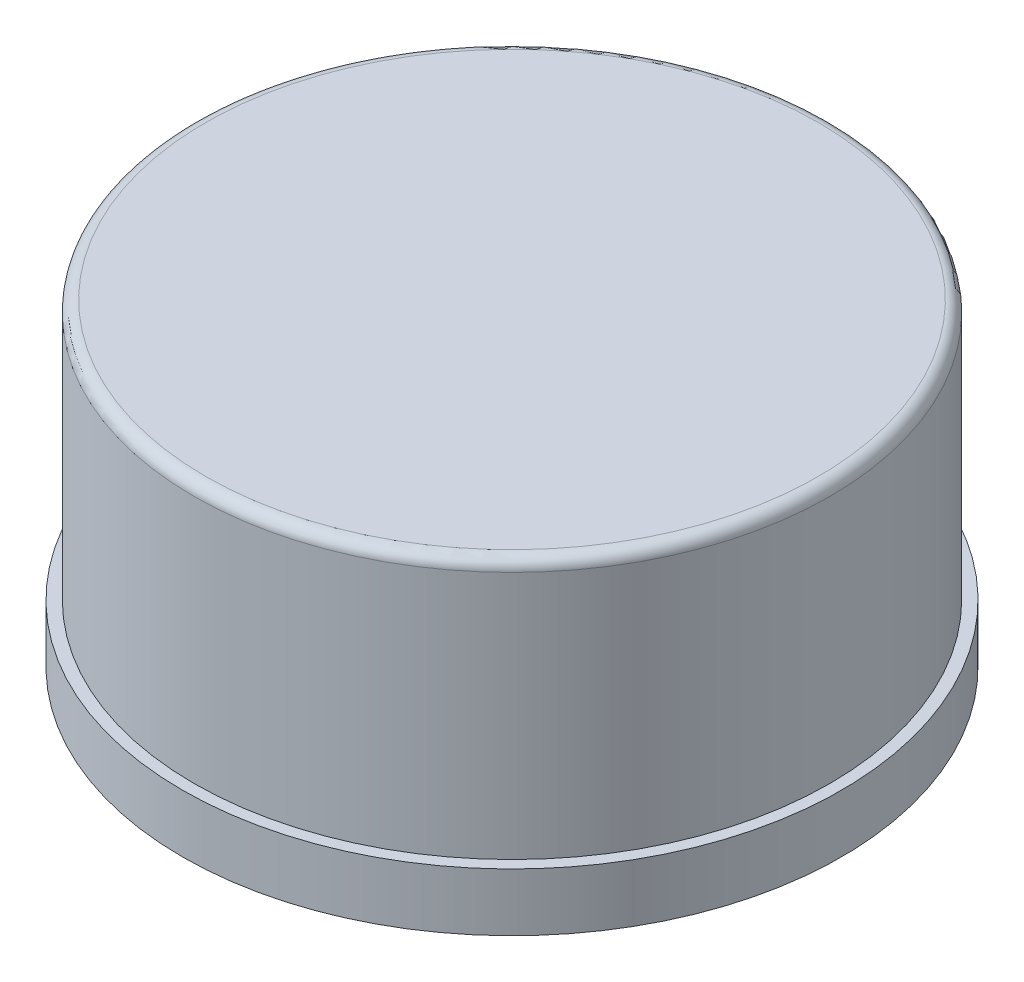
ISO-10303-21;
HEADER;
FILE_DESCRIPTION(('STEP AP214'),'2;1');
FILE_NAME('part.step','',(''),(''),'','','');
FILE_SCHEMA(('AUTOMOTIVE_DESIGN { 1 0 10303 214 1 1 1 1 }'));
ENDSEC;
DATA;
#1=APPLICATION_CONTEXT('core data for automotive mechanical design processes');
#2=APPLICATION_PROTOCOL_DEFINITION('international standard','automotive_design',2000,#1);
#3=PRODUCT_CONTEXT('',#1,'mechanical');
#4=PRODUCT('Part','Part','',(#3));
#5=PRODUCT_RELATED_PRODUCT_CATEGORY('part','',(#4));
#6=PRODUCT_DEFINITION_FORMATION('','',#4);
#7=PRODUCT_DEFINITION_CONTEXT('part definition',#1,'design');
#8=PRODUCT_DEFINITION('design','',#6,#7);
#9=PRODUCT_DEFINITION_SHAPE('','',#8);
#10=(LENGTH_UNIT() NAMED_UNIT(*) SI_UNIT(.MILLI.,.METRE.));
#11=(NAMED_UNIT(*) PLANE_ANGLE_UNIT() SI_UNIT($,.RADIAN.));
#12=(NAMED_UNIT(*) SI_UNIT($,.STERADIAN.) SOLID_ANGLE_UNIT());
#13=UNCERTAINTY_MEASURE_WITH_UNIT(LENGTH_MEASURE(1.E-05),#10,'distance_accuracy_value','');
#14=(GEOMETRIC_REPRESENTATION_CONTEXT(3) GLOBAL_UNCERTAINTY_ASSIGNED_CONTEXT((#13)) GLOBAL_UNIT_ASSIGNED_CONTEXT((#10,
#11,#12)) REPRESENTATION_CONTEXT('',''));
#15=CARTESIAN_POINT('',(0.,0.,0.));
#16=DIRECTION('',(0.,0.,1.));
#17=DIRECTION('',(1.,0.,0.));
#18=AXIS2_PLACEMENT_3D('',#15,#16,#17);
#19=CARTESIAN_POINT('',(0.,0.,0.));
#20=DIRECTION('',(0.,1.,0.));
#21=DIRECTION('',(0.,0.,1.));
#22=AXIS2_PLACEMENT_3D('',#19,#20,#21);
#23=PLANE('',#22);
#24=CARTESIAN_POINT('',(0.,0.,0.));
#25=DIRECTION('',(0.,1.,0.));
#26=DIRECTION('',(0.,0.,1.));
#27=AXIS2_PLACEMENT_3D('',#24,#25,#26);
#28=CIRCLE('',#27,5.7);
#29=CARTESIAN_POINT('',(0.,0.,5.7));
#30=VERTEX_POINT('',#29);
#31=EDGE_CURVE('E175',#30,#30,#28,.T.);
#32=ORIENTED_EDGE('',*,*,#31,.F.);
#33=EDGE_LOOP('',(#32));
#34=FACE_BOUND('',#33,.T.);
#35=DIRECTION('',(0.,0.,1.));
#36=VECTOR('',#35,1.);
#37=CARTESIAN_POINT('',(2.5,0.,-2.5));
#38=LINE('',#37,#36);
#39=CARTESIAN_POINT('',(2.5,0.,-2.5));
#40=VERTEX_POINT('',#39);
#41=CARTESIAN_POINT('',(2.5,0.,2.5));
#42=VERTEX_POINT('',#41);
#43=EDGE_CURVE('E143',#40,#42,#38,.T.);
#44=ORIENTED_EDGE('',*,*,#43,.F.);
#45=DIRECTION('',(-1.,0.,0.));
#46=VECTOR('',#45,1.);
#47=CARTESIAN_POINT('',(2.5,0.,-2.5));
#48=LINE('',#47,#46);
#49=CARTESIAN_POINT('',(-2.5,0.,-2.5));
#50=VERTEX_POINT('',#49);
#51=EDGE_CURVE('E148',#40,#50,#48,.T.);
#52=ORIENTED_EDGE('',*,*,#51,.T.);
#53=DIRECTION('',(0.,0.,1.));
#54=VECTOR('',#53,1.);
#55=CARTESIAN_POINT('',(-2.5,0.,-2.5));
#56=LINE('',#55,#54);
#57=CARTESIAN_POINT('',(-2.5,0.,2.5));
#58=VERTEX_POINT('',#57);
#59=EDGE_CURVE('E58',#50,#58,#56,.T.);
#60=ORIENTED_EDGE('',*,*,#59,.T.);
#61=DIRECTION('',(-1.,0.,0.));
#62=VECTOR('',#61,1.);
#63=CARTESIAN_POINT('',(2.5,0.,2.5));
#64=LINE('',#63,#62);
#65=EDGE_CURVE('E159',#42,#58,#64,.T.);
#66=ORIENTED_EDGE('',*,*,#65,.F.);
#67=EDGE_LOOP('',(#44,#52,#60,#66));
#68=FACE_BOUND('',#67,.T.);
#69=ADVANCED_FACE('F35',(#34,#68),#23,.F.);
#70=CARTESIAN_POINT('',(0.,1.,0.));
#71=DIRECTION('',(0.,1.,0.));
#72=DIRECTION('',(0.,0.,1.));
#73=AXIS2_PLACEMENT_3D('',#70,#71,#72);
#74=PLANE('',#73);
#75=CARTESIAN_POINT('',(0.,1.,0.));
#76=DIRECTION('',(0.,1.,0.));
#77=DIRECTION('',(0.,0.,1.));
#78=AXIS2_PLACEMENT_3D('',#75,#76,#77);
#79=CIRCLE('',#78,5.7);
#80=CARTESIAN_POINT('',(0.,1.,5.7));
#81=VERTEX_POINT('',#80);
#82=EDGE_CURVE('E176',#81,#81,#79,.T.);
#83=ORIENTED_EDGE('',*,*,#82,.T.);
#84=EDGE_LOOP('',(#83));
#85=FACE_BOUND('',#84,.T.);
#86=CARTESIAN_POINT('',(0.,1.,0.));
#87=DIRECTION('',(0.,1.,0.));
#88=DIRECTION('',(0.,0.,1.));
#89=AXIS2_PLACEMENT_3D('',#86,#87,#88);
#90=CIRCLE('',#89,5.5);
#91=CARTESIAN_POINT('',(0.,1.,5.5));
#92=VERTEX_POINT('',#91);
#93=EDGE_CURVE('E172',#92,#92,#90,.T.);
#94=ORIENTED_EDGE('',*,*,#93,.F.);
#95=EDGE_LOOP('',(#94));
#96=FACE_BOUND('',#95,.T.);
#97=ADVANCED_FACE('F199',(#85,#96),#74,.T.);
#98=CARTESIAN_POINT('',(0.,1.,0.));
#99=DIRECTION('',(0.,-1.,0.));
#100=DIRECTION('',(0.,0.,-1.));
#101=AXIS2_PLACEMENT_3D('',#98,#99,#100);
#102=CYLINDRICAL_SURFACE('',#101,5.7);
#103=ORIENTED_EDGE('',*,*,#82,.F.);
#104=EDGE_LOOP('',(#103));
#105=FACE_BOUND('',#104,.T.);
#106=ORIENTED_EDGE('',*,*,#31,.T.);
#107=EDGE_LOOP('',(#106));
#108=FACE_BOUND('',#107,.T.);
#109=ADVANCED_FACE('F205',(#105,#108),#102,.T.);
#110=CARTESIAN_POINT('',(0.,5.5,0.));
#111=DIRECTION('',(0.,-1.,0.));
#112=DIRECTION('',(0.,0.,-1.));
#113=AXIS2_PLACEMENT_3D('',#110,#111,#112);
#114=CYLINDRICAL_SURFACE('',#113,5.5);
#115=CARTESIAN_POINT('',(0.,5.3,0.));
#116=DIRECTION('',(0.,1.,0.));
#117=DIRECTION('',(0.,0.,1.));
#118=AXIS2_PLACEMENT_3D('',#115,#116,#117);
#119=CIRCLE('',#118,5.5);
#120=CARTESIAN_POINT('',(0.,5.3,5.5));
#121=VERTEX_POINT('',#120);
#122=EDGE_CURVE('E11',#121,#121,#119,.F.);
#123=ORIENTED_EDGE('',*,*,#122,.T.);
#124=EDGE_LOOP('',(#123));
#125=FACE_BOUND('',#124,.T.);
#126=ORIENTED_EDGE('',*,*,#93,.T.);
#127=EDGE_LOOP('',(#126));
#128=FACE_BOUND('',#127,.T.);
#129=ADVANCED_FACE('F195',(#125,#128),#114,.T.);
#130=CARTESIAN_POINT('',(0.,5.5,0.));
#131=DIRECTION('',(0.,1.,0.));
#132=DIRECTION('',(0.,0.,1.));
#133=AXIS2_PLACEMENT_3D('',#130,#131,#132);
#134=PLANE('',#133);
#135=CARTESIAN_POINT('',(0.,5.5,0.));
#136=DIRECTION('',(0.,1.,0.));
#137=DIRECTION('',(0.,0.,1.));
#138=AXIS2_PLACEMENT_3D('',#135,#136,#137);
#139=CIRCLE('',#138,5.3);
#140=CARTESIAN_POINT('',(0.,5.5,5.3));
#141=VERTEX_POINT('',#140);
#142=EDGE_CURVE('E43',#141,#141,#139,.T.);
#143=ORIENTED_EDGE('',*,*,#142,.T.);
#144=EDGE_LOOP('',(#143));
#145=FACE_BOUND('',#144,.T.);
#146=ADVANCED_FACE('F183',(#145),#134,.T.);
#147=CARTESIAN_POINT('',(0.,5.3,0.));
#148=DIRECTION('',(0.,1.,0.));
#149=DIRECTION('',(0.,0.,1.));
#150=AXIS2_PLACEMENT_3D('',#147,#148,#149);
#151=TOROIDAL_SURFACE('',#150,5.3,0.2);
#152=ORIENTED_EDGE('',*,*,#122,.F.);
#153=EDGE_LOOP('',(#152));
#154=FACE_BOUND('',#153,.T.);
#155=ORIENTED_EDGE('',*,*,#142,.F.);
#156=EDGE_LOOP('',(#155));
#157=FACE_BOUND('',#156,.T.);
#158=ADVANCED_FACE('F37',(#154,#157),#151,.T.);
#159=CARTESIAN_POINT('',(2.5,-0.1,-2.5));
#160=DIRECTION('',(-1.,0.,0.));
#161=DIRECTION('',(0.,0.,1.));
#162=AXIS2_PLACEMENT_3D('',#159,#160,#161);
#163=PLANE('',#162);
#164=ORIENTED_EDGE('',*,*,#43,.T.);
#165=DIRECTION('',(0.,1.,0.));
#166=VECTOR('',#165,1.);
#167=CARTESIAN_POINT('',(2.5,-0.1,2.5));
#168=LINE('',#167,#166);
#169=CARTESIAN_POINT('',(2.5,-0.1,2.5));
#170=VERTEX_POINT('',#169);
#171=EDGE_CURVE('E170',#170,#42,#168,.T.);
#172=ORIENTED_EDGE('',*,*,#171,.F.);
#173=DIRECTION('',(0.,0.,1.));
#174=VECTOR('',#173,1.);
#175=CARTESIAN_POINT('',(2.5,-0.1,-2.5));
#176=LINE('',#175,#174);
#177=CARTESIAN_POINT('',(2.5,-0.1,-2.5));
#178=VERTEX_POINT('',#177);
#179=EDGE_CURVE('E144',#178,#170,#176,.T.);
#180=ORIENTED_EDGE('',*,*,#179,.F.);
#181=DIRECTION('',(0.,1.,0.));
#182=VECTOR('',#181,1.);
#183=CARTESIAN_POINT('',(2.5,-0.1,-2.5));
#184=LINE('',#183,#182);
#185=EDGE_CURVE('E156',#178,#40,#184,.T.);
#186=ORIENTED_EDGE('',*,*,#185,.T.);
#187=EDGE_LOOP('',(#164,#172,#180,#186));
#188=FACE_BOUND('',#187,.T.);
#189=ADVANCED_FACE('F186',(#188),#163,.F.);
#190=CARTESIAN_POINT('',(2.5,-0.1,2.5));
#191=DIRECTION('',(0.,0.,-1.));
#192=DIRECTION('',(-1.,0.,0.));
#193=AXIS2_PLACEMENT_3D('',#190,#191,#192);
#194=PLANE('',#193);
#195=ORIENTED_EDGE('',*,*,#65,.T.);
#196=DIRECTION('',(0.,1.,0.));
#197=VECTOR('',#196,1.);
#198=CARTESIAN_POINT('',(-2.5,-0.1,2.5));
#199=LINE('',#198,#197);
#200=CARTESIAN_POINT('',(-2.5,-0.1,2.5));
#201=VERTEX_POINT('',#200);
#202=EDGE_CURVE('E168',#201,#58,#199,.T.);
#203=ORIENTED_EDGE('',*,*,#202,.F.);
#204=DIRECTION('',(-1.,0.,0.));
#205=VECTOR('',#204,1.);
#206=CARTESIAN_POINT('',(2.5,-0.1,2.5));
#207=LINE('',#206,#205);
#208=EDGE_CURVE('E147',#170,#201,#207,.T.);
#209=ORIENTED_EDGE('',*,*,#208,.F.);
#210=ORIENTED_EDGE('',*,*,#171,.T.);
#211=EDGE_LOOP('',(#195,#203,#209,#210));
#212=FACE_BOUND('',#211,.T.);
#213=ADVANCED_FACE('F192',(#212),#194,.F.);
#214=CARTESIAN_POINT('',(-2.5,-0.1,-2.5));
#215=DIRECTION('',(-1.,0.,0.));
#216=DIRECTION('',(0.,0.,1.));
#217=AXIS2_PLACEMENT_3D('',#214,#215,#216);
#218=PLANE('',#217);
#219=ORIENTED_EDGE('',*,*,#59,.F.);
#220=DIRECTION('',(0.,1.,0.));
#221=VECTOR('',#220,1.);
#222=CARTESIAN_POINT('',(-2.5,-0.1,-2.5));
#223=LINE('',#222,#221);
#224=CARTESIAN_POINT('',(-2.5,-0.1,-2.5));
#225=VERTEX_POINT('',#224);
#226=EDGE_CURVE('E166',#225,#50,#223,.T.);
#227=ORIENTED_EDGE('',*,*,#226,.F.);
#228=DIRECTION('',(0.,0.,1.));
#229=VECTOR('',#228,1.);
#230=CARTESIAN_POINT('',(-2.5,-0.1,-2.5));
#231=LINE('',#230,#229);
#232=EDGE_CURVE('E150',#225,#201,#231,.T.);
#233=ORIENTED_EDGE('',*,*,#232,.T.);
#234=ORIENTED_EDGE('',*,*,#202,.T.);
#235=EDGE_LOOP('',(#219,#227,#233,#234));
#236=FACE_BOUND('',#235,.T.);
#237=ADVANCED_FACE('F227',(#236),#218,.T.);
#238=CARTESIAN_POINT('',(2.5,-0.1,-2.5));
#239=DIRECTION('',(0.,0.,-1.));
#240=DIRECTION('',(-1.,0.,0.));
#241=AXIS2_PLACEMENT_3D('',#238,#239,#240);
#242=PLANE('',#241);
#243=ORIENTED_EDGE('',*,*,#51,.F.);
#244=ORIENTED_EDGE('',*,*,#185,.F.);
#245=DIRECTION('',(-1.,0.,0.));
#246=VECTOR('',#245,1.);
#247=CARTESIAN_POINT('',(2.5,-0.1,-2.5));
#248=LINE('',#247,#246);
#249=EDGE_CURVE('E153',#178,#225,#248,.T.);
#250=ORIENTED_EDGE('',*,*,#249,.T.);
#251=ORIENTED_EDGE('',*,*,#226,.T.);
#252=EDGE_LOOP('',(#243,#244,#250,#251));
#253=FACE_BOUND('',#252,.T.);
#254=ADVANCED_FACE('F231',(#253),#242,.T.);
#255=CARTESIAN_POINT('',(0.,-0.1,0.));
#256=DIRECTION('',(0.,-1.,0.));
#257=DIRECTION('',(0.,0.,-1.));
#258=AXIS2_PLACEMENT_3D('',#255,#256,#257);
#259=PLANE('',#258);
#260=DIRECTION('',(0.,0.,1.));
#261=VECTOR('',#260,1.);
#262=CARTESIAN_POINT('',(1.9,-0.1,-2.5));
#263=LINE('',#262,#261);
#264=CARTESIAN_POINT('',(1.9,-0.1,-1.9));
#265=VERTEX_POINT('',#264);
#266=CARTESIAN_POINT('',(1.9,-0.1,1.9));
#267=VERTEX_POINT('',#266);
#268=EDGE_CURVE('E121',#265,#267,#263,.T.);
#269=ORIENTED_EDGE('',*,*,#268,.F.);
#270=DIRECTION('',(-1.,0.,0.));
#271=VECTOR('',#270,1.);
#272=CARTESIAN_POINT('',(2.5,-0.1,-1.9));
#273=LINE('',#272,#271);
#274=CARTESIAN_POINT('',(-1.9,-0.1,-1.9));
#275=VERTEX_POINT('',#274);
#276=EDGE_CURVE('E136',#265,#275,#273,.T.);
#277=ORIENTED_EDGE('',*,*,#276,.T.);
#278=DIRECTION('',(0.,0.,1.));
#279=VECTOR('',#278,1.);
#280=CARTESIAN_POINT('',(-1.9,-0.1,-2.5));
#281=LINE('',#280,#279);
#282=CARTESIAN_POINT('',(-1.9,-0.1,1.9));
#283=VERTEX_POINT('',#282);
#284=EDGE_CURVE('E50',#275,#283,#281,.T.);
#285=ORIENTED_EDGE('',*,*,#284,.T.);
#286=DIRECTION('',(-1.,0.,0.));
#287=VECTOR('',#286,1.);
#288=CARTESIAN_POINT('',(2.5,-0.1,1.9));
#289=LINE('',#288,#287);
#290=EDGE_CURVE('E123',#267,#283,#289,.T.);
#291=ORIENTED_EDGE('',*,*,#290,.F.);
#292=EDGE_LOOP('',(#269,#277,#285,#291));
#293=FACE_BOUND('',#292,.T.);
#294=ORIENTED_EDGE('',*,*,#179,.T.);
#295=ORIENTED_EDGE('',*,*,#208,.T.);
#296=ORIENTED_EDGE('',*,*,#232,.F.);
#297=ORIENTED_EDGE('',*,*,#249,.F.);
#298=EDGE_LOOP('',(#294,#295,#296,#297));
#299=FACE_BOUND('',#298,.T.);
#300=ADVANCED_FACE('F234',(#293,#299),#259,.T.);
#301=CARTESIAN_POINT('',(0.,5.5,0.));
#302=DIRECTION('',(0.,-1.,0.));
#303=DIRECTION('',(0.,0.,-1.));
#304=AXIS2_PLACEMENT_3D('',#301,#302,#303);
#305=CYLINDRICAL_SURFACE('',#304,4.9);
#306=CARTESIAN_POINT('',(0.,4.9,0.));
#307=DIRECTION('',(0.,1.,0.));
#308=DIRECTION('',(0.,0.,1.));
#309=AXIS2_PLACEMENT_3D('',#306,#307,#308);
#310=CIRCLE('',#309,4.9);
#311=CARTESIAN_POINT('',(0.,4.9,4.9));
#312=VERTEX_POINT('',#311);
#313=EDGE_CURVE('E129',#312,#312,#310,.T.);
#314=ORIENTED_EDGE('',*,*,#313,.T.);
#315=EDGE_LOOP('',(#314));
#316=FACE_BOUND('',#315,.T.);
#317=CARTESIAN_POINT('',(0.,0.6,0.));
#318=DIRECTION('',(0.,1.,0.));
#319=DIRECTION('',(0.,0.,1.));
#320=AXIS2_PLACEMENT_3D('',#317,#318,#319);
#321=CIRCLE('',#320,4.9);
#322=CARTESIAN_POINT('',(0.,0.6,4.9));
#323=VERTEX_POINT('',#322);
#324=EDGE_CURVE('E132',#323,#323,#321,.T.);
#325=ORIENTED_EDGE('',*,*,#324,.F.);
#326=EDGE_LOOP('',(#325));
#327=FACE_BOUND('',#326,.T.);
#328=ADVANCED_FACE('F238',(#316,#327),#305,.F.);
#329=CARTESIAN_POINT('',(0.,0.6,0.));
#330=DIRECTION('',(0.,1.,0.));
#331=DIRECTION('',(0.,0.,1.));
#332=AXIS2_PLACEMENT_3D('',#329,#330,#331);
#333=PLANE('',#332);
#334=ORIENTED_EDGE('',*,*,#324,.T.);
#335=EDGE_LOOP('',(#334));
#336=FACE_BOUND('',#335,.T.);
#337=DIRECTION('',(0.,0.,1.));
#338=VECTOR('',#337,1.);
#339=CARTESIAN_POINT('',(1.9,0.6,0.));
#340=LINE('',#339,#338);
#341=CARTESIAN_POINT('',(1.9,0.6,-1.9));
#342=VERTEX_POINT('',#341);
#343=CARTESIAN_POINT('',(1.9,0.6,1.9));
#344=VERTEX_POINT('',#343);
#345=EDGE_CURVE('E126',#342,#344,#340,.T.);
#346=ORIENTED_EDGE('',*,*,#345,.T.);
#347=DIRECTION('',(-1.,0.,0.));
#348=VECTOR('',#347,1.);
#349=CARTESIAN_POINT('',(0.,0.6,1.9));
#350=LINE('',#349,#348);
#351=CARTESIAN_POINT('',(-1.9,0.6,1.9));
#352=VERTEX_POINT('',#351);
#353=EDGE_CURVE('E110',#344,#352,#350,.T.);
#354=ORIENTED_EDGE('',*,*,#353,.T.);
#355=DIRECTION('',(0.,0.,1.));
#356=VECTOR('',#355,1.);
#357=CARTESIAN_POINT('',(-1.9,0.6,0.));
#358=LINE('',#357,#356);
#359=CARTESIAN_POINT('',(-1.9,0.6,-1.9));
#360=VERTEX_POINT('',#359);
#361=EDGE_CURVE('E103',#360,#352,#358,.T.);
#362=ORIENTED_EDGE('',*,*,#361,.F.);
#363=DIRECTION('',(-1.,0.,0.));
#364=VECTOR('',#363,1.);
#365=CARTESIAN_POINT('',(0.,0.6,-1.9));
#366=LINE('',#365,#364);
#367=EDGE_CURVE('E107',#342,#360,#366,.T.);
#368=ORIENTED_EDGE('',*,*,#367,.F.);
#369=EDGE_LOOP('',(#346,#354,#362,#368));
#370=FACE_BOUND('',#369,.T.);
#371=ADVANCED_FACE('F105',(#336,#370),#333,.T.);
#372=CARTESIAN_POINT('',(0.,4.9,0.));
#373=DIRECTION('',(0.,1.,0.));
#374=DIRECTION('',(0.,0.,1.));
#375=AXIS2_PLACEMENT_3D('',#372,#373,#374);
#376=PLANE('',#375);
#377=ORIENTED_EDGE('',*,*,#313,.F.);
#378=EDGE_LOOP('',(#377));
#379=FACE_BOUND('',#378,.T.);
#380=ADVANCED_FACE('F251',(#379),#376,.F.);
#381=CARTESIAN_POINT('',(1.9,-0.1,-2.5));
#382=DIRECTION('',(-1.,0.,0.));
#383=DIRECTION('',(0.,0.,1.));
#384=AXIS2_PLACEMENT_3D('',#381,#382,#383);
#385=PLANE('',#384);
#386=ORIENTED_EDGE('',*,*,#345,.F.);
#387=DIRECTION('',(0.,1.,0.));
#388=VECTOR('',#387,1.);
#389=CARTESIAN_POINT('',(1.9,-0.1,-1.9));
#390=LINE('',#389,#388);
#391=EDGE_CURVE('E118',#265,#342,#390,.T.);
#392=ORIENTED_EDGE('',*,*,#391,.F.);
#393=ORIENTED_EDGE('',*,*,#268,.T.);
#394=DIRECTION('',(0.,1.,0.));
#395=VECTOR('',#394,1.);
#396=CARTESIAN_POINT('',(1.9,-0.1,1.9));
#397=LINE('',#396,#395);
#398=EDGE_CURVE('E133',#267,#344,#397,.T.);
#399=ORIENTED_EDGE('',*,*,#398,.T.);
#400=EDGE_LOOP('',(#386,#392,#393,#399));
#401=FACE_BOUND('',#400,.T.);
#402=ADVANCED_FACE('F247',(#401),#385,.T.);
#403=CARTESIAN_POINT('',(2.5,-0.1,1.9));
#404=DIRECTION('',(0.,0.,-1.));
#405=DIRECTION('',(-1.,0.,0.));
#406=AXIS2_PLACEMENT_3D('',#403,#404,#405);
#407=PLANE('',#406);
#408=ORIENTED_EDGE('',*,*,#353,.F.);
#409=ORIENTED_EDGE('',*,*,#398,.F.);
#410=ORIENTED_EDGE('',*,*,#290,.T.);
#411=DIRECTION('',(0.,1.,0.));
#412=VECTOR('',#411,1.);
#413=CARTESIAN_POINT('',(-1.9,-0.1,1.9));
#414=LINE('',#413,#412);
#415=EDGE_CURVE('E117',#283,#352,#414,.T.);
#416=ORIENTED_EDGE('',*,*,#415,.T.);
#417=EDGE_LOOP('',(#408,#409,#410,#416));
#418=FACE_BOUND('',#417,.T.);
#419=ADVANCED_FACE('F244',(#418),#407,.T.);
#420=CARTESIAN_POINT('',(-1.9,-0.1,-2.5));
#421=DIRECTION('',(-1.,0.,0.));
#422=DIRECTION('',(0.,0.,1.));
#423=AXIS2_PLACEMENT_3D('',#420,#421,#422);
#424=PLANE('',#423);
#425=ORIENTED_EDGE('',*,*,#361,.T.);
#426=ORIENTED_EDGE('',*,*,#415,.F.);
#427=ORIENTED_EDGE('',*,*,#284,.F.);
#428=DIRECTION('',(0.,1.,0.));
#429=VECTOR('',#428,1.);
#430=CARTESIAN_POINT('',(-1.9,-0.1,-1.9));
#431=LINE('',#430,#429);
#432=EDGE_CURVE('E112',#275,#360,#431,.T.);
#433=ORIENTED_EDGE('',*,*,#432,.T.);
#434=EDGE_LOOP('',(#425,#426,#427,#433));
#435=FACE_BOUND('',#434,.T.);
#436=ADVANCED_FACE('F113',(#435),#424,.F.);
#437=CARTESIAN_POINT('',(2.5,-0.1,-1.9));
#438=DIRECTION('',(0.,0.,-1.));
#439=DIRECTION('',(-1.,0.,0.));
#440=AXIS2_PLACEMENT_3D('',#437,#438,#439);
#441=PLANE('',#440);
#442=ORIENTED_EDGE('',*,*,#367,.T.);
#443=ORIENTED_EDGE('',*,*,#432,.F.);
#444=ORIENTED_EDGE('',*,*,#276,.F.);
#445=ORIENTED_EDGE('',*,*,#391,.T.);
#446=EDGE_LOOP('',(#442,#443,#444,#445));
#447=FACE_BOUND('',#446,.T.);
#448=ADVANCED_FACE('F120',(#447),#441,.F.);
#449=CLOSED_SHELL('',(#69,#97,#109,#129,#146,#158,#189,#213,#237,#254,#300,#328,#371,#380,#402,
#419,#436,#448));
#450=MANIFOLD_SOLID_BREP('B2',#449);
#451=ADVANCED_BREP_SHAPE_REPRESENTATION('',(#18,#450),#14);
#452=SHAPE_DEFINITION_REPRESENTATION(#9,#451);
ENDSEC;
END-ISO-10303-21;
